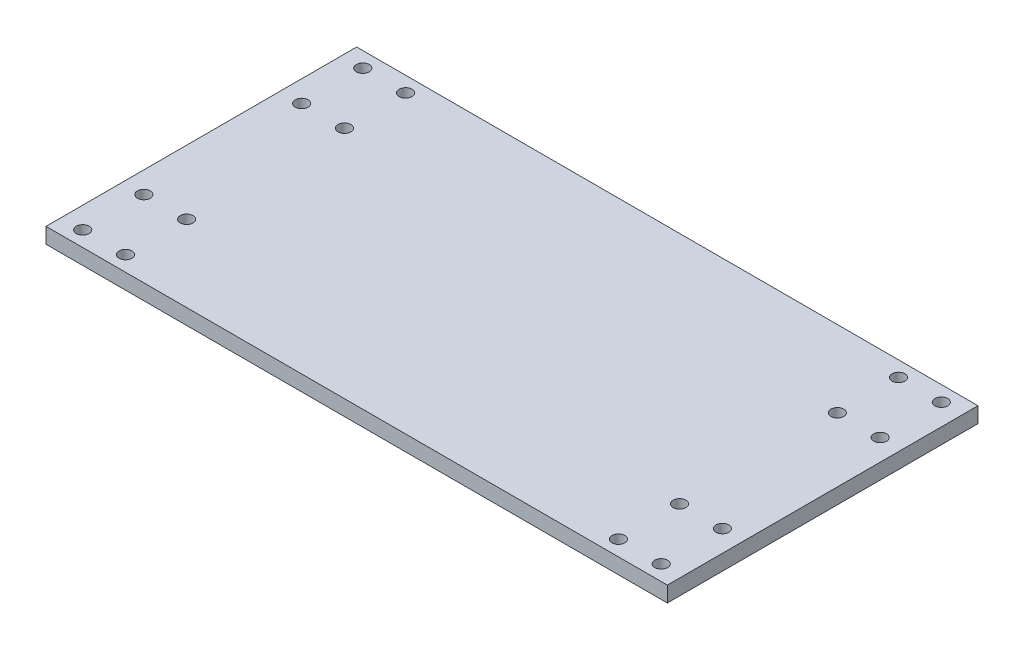
ISO-10303-21;
HEADER;
FILE_DESCRIPTION(('STEP AP214'),'2;1');
FILE_NAME('part.step','',(''),(''),'','','');
FILE_SCHEMA(('AUTOMOTIVE_DESIGN { 1 0 10303 214 1 1 1 1 }'));
ENDSEC;
DATA;
#1=APPLICATION_CONTEXT('core data for automotive mechanical design processes');
#2=APPLICATION_PROTOCOL_DEFINITION('international standard','automotive_design',2000,#1);
#3=PRODUCT_CONTEXT('',#1,'mechanical');
#4=PRODUCT('Part','Part','',(#3));
#5=PRODUCT_RELATED_PRODUCT_CATEGORY('part','',(#4));
#6=PRODUCT_DEFINITION_FORMATION('','',#4);
#7=PRODUCT_DEFINITION_CONTEXT('part definition',#1,'design');
#8=PRODUCT_DEFINITION('design','',#6,#7);
#9=PRODUCT_DEFINITION_SHAPE('','',#8);
#10=(LENGTH_UNIT() NAMED_UNIT(*) SI_UNIT(.MILLI.,.METRE.));
#11=(NAMED_UNIT(*) PLANE_ANGLE_UNIT() SI_UNIT($,.RADIAN.));
#12=(NAMED_UNIT(*) SI_UNIT($,.STERADIAN.) SOLID_ANGLE_UNIT());
#13=UNCERTAINTY_MEASURE_WITH_UNIT(LENGTH_MEASURE(1.E-05),#10,'distance_accuracy_value','');
#14=(GEOMETRIC_REPRESENTATION_CONTEXT(3) GLOBAL_UNCERTAINTY_ASSIGNED_CONTEXT((#13)) GLOBAL_UNIT_ASSIGNED_CONTEXT((#10,
#11,#12)) REPRESENTATION_CONTEXT('',''));
#15=CARTESIAN_POINT('',(0.,0.,0.));
#16=DIRECTION('',(0.,0.,1.));
#17=DIRECTION('',(1.,0.,0.));
#18=AXIS2_PLACEMENT_3D('',#15,#16,#17);
#19=CARTESIAN_POINT('',(0.,5.08,0.));
#20=DIRECTION('',(0.,1.,0.));
#21=DIRECTION('',(0.,0.,1.));
#22=AXIS2_PLACEMENT_3D('',#19,#20,#21);
#23=PLANE('',#22);
#24=CARTESIAN_POINT('',(196.2,5.08,5.00000000000002));
#25=DIRECTION('',(0.,-1.,0.));
#26=DIRECTION('',(0.,0.,-1.));
#27=AXIS2_PLACEMENT_3D('',#24,#25,#26);
#28=CIRCLE('',#27,2.09999999999999);
#29=CARTESIAN_POINT('',(196.2,5.08,2.90000000000003));
#30=VERTEX_POINT('',#29);
#31=EDGE_CURVE('E207',#30,#30,#28,.T.);
#32=ORIENTED_EDGE('',*,*,#31,.T.);
#33=EDGE_LOOP('',(#32));
#34=FACE_BOUND('',#33,.T.);
#35=CARTESIAN_POINT('',(182.2,5.08,5.00000000000002));
#36=DIRECTION('',(0.,-1.,0.));
#37=DIRECTION('',(0.,0.,-1.));
#38=AXIS2_PLACEMENT_3D('',#35,#36,#37);
#39=CIRCLE('',#38,2.09999999999999);
#40=CARTESIAN_POINT('',(182.2,5.08,2.90000000000003));
#41=VERTEX_POINT('',#40);
#42=EDGE_CURVE('E201',#41,#41,#39,.T.);
#43=ORIENTED_EDGE('',*,*,#42,.T.);
#44=EDGE_LOOP('',(#43));
#45=FACE_BOUND('',#44,.T.);
#46=CARTESIAN_POINT('',(196.2,5.08,25.));
#47=DIRECTION('',(0.,-1.,0.));
#48=DIRECTION('',(0.,0.,-1.));
#49=AXIS2_PLACEMENT_3D('',#46,#47,#48);
#50=CIRCLE('',#49,2.09999999999999);
#51=CARTESIAN_POINT('',(196.2,5.08,22.9));
#52=VERTEX_POINT('',#51);
#53=EDGE_CURVE('E195',#52,#52,#50,.T.);
#54=ORIENTED_EDGE('',*,*,#53,.T.);
#55=EDGE_LOOP('',(#54));
#56=FACE_BOUND('',#55,.T.);
#57=CARTESIAN_POINT('',(182.2,5.08,25.));
#58=DIRECTION('',(0.,-1.,0.));
#59=DIRECTION('',(0.,0.,-1.));
#60=AXIS2_PLACEMENT_3D('',#57,#58,#59);
#61=CIRCLE('',#60,2.09999999999999);
#62=CARTESIAN_POINT('',(182.2,5.08,22.9));
#63=VERTEX_POINT('',#62);
#64=EDGE_CURVE('E189',#63,#63,#61,.T.);
#65=ORIENTED_EDGE('',*,*,#64,.T.);
#66=EDGE_LOOP('',(#65));
#67=FACE_BOUND('',#66,.T.);
#68=DIRECTION('',(0.,0.,1.));
#69=VECTOR('',#68,1.);
#70=CARTESIAN_POINT('',(0.,5.08,0.));
#71=LINE('',#70,#69);
#72=CARTESIAN_POINT('',(0.,5.08,0.));
#73=VERTEX_POINT('',#72);
#74=CARTESIAN_POINT('',(0.,5.08,101.6));
#75=VERTEX_POINT('',#74);
#76=EDGE_CURVE('E91',#73,#75,#71,.T.);
#77=ORIENTED_EDGE('',*,*,#76,.T.);
#78=DIRECTION('',(1.,0.,0.));
#79=VECTOR('',#78,1.);
#80=CARTESIAN_POINT('',(0.,5.08,101.6));
#81=LINE('',#80,#79);
#82=CARTESIAN_POINT('',(203.2,5.08,101.6));
#83=VERTEX_POINT('',#82);
#84=EDGE_CURVE('E86',#75,#83,#81,.T.);
#85=ORIENTED_EDGE('',*,*,#84,.T.);
#86=DIRECTION('',(0.,0.,-1.));
#87=VECTOR('',#86,1.);
#88=CARTESIAN_POINT('',(203.2,5.08,0.));
#89=LINE('',#88,#87);
#90=CARTESIAN_POINT('',(203.2,5.08,0.));
#91=VERTEX_POINT('',#90);
#92=EDGE_CURVE('E89',#83,#91,#89,.T.);
#93=ORIENTED_EDGE('',*,*,#92,.T.);
#94=DIRECTION('',(-1.,0.,0.));
#95=VECTOR('',#94,1.);
#96=CARTESIAN_POINT('',(0.,5.08,0.));
#97=LINE('',#96,#95);
#98=EDGE_CURVE('E56',#91,#73,#97,.T.);
#99=ORIENTED_EDGE('',*,*,#98,.T.);
#100=EDGE_LOOP('',(#77,#85,#93,#99));
#101=FACE_BOUND('',#100,.T.);
#102=CARTESIAN_POINT('',(7.00000000000003,5.08,96.6));
#103=DIRECTION('',(0.,-1.,0.));
#104=DIRECTION('',(0.,0.,-1.));
#105=AXIS2_PLACEMENT_3D('',#102,#103,#104);
#106=CIRCLE('',#105,2.1);
#107=CARTESIAN_POINT('',(7.00000000000003,5.08,94.5));
#108=VERTEX_POINT('',#107);
#109=EDGE_CURVE('E106',#108,#108,#106,.T.);
#110=ORIENTED_EDGE('',*,*,#109,.T.);
#111=EDGE_LOOP('',(#110));
#112=FACE_BOUND('',#111,.T.);
#113=CARTESIAN_POINT('',(21.,5.08,96.6));
#114=DIRECTION('',(0.,-1.,0.));
#115=DIRECTION('',(0.,0.,-1.));
#116=AXIS2_PLACEMENT_3D('',#113,#114,#115);
#117=CIRCLE('',#116,2.1);
#118=CARTESIAN_POINT('',(21.,5.08,94.5));
#119=VERTEX_POINT('',#118);
#120=EDGE_CURVE('E123',#119,#119,#117,.T.);
#121=ORIENTED_EDGE('',*,*,#120,.T.);
#122=EDGE_LOOP('',(#121));
#123=FACE_BOUND('',#122,.T.);
#124=CARTESIAN_POINT('',(21.,5.08,76.6));
#125=DIRECTION('',(0.,-1.,0.));
#126=DIRECTION('',(0.,0.,-1.));
#127=AXIS2_PLACEMENT_3D('',#124,#125,#126);
#128=CIRCLE('',#127,2.1);
#129=CARTESIAN_POINT('',(21.,5.08,74.5));
#130=VERTEX_POINT('',#129);
#131=EDGE_CURVE('E129',#130,#130,#128,.T.);
#132=ORIENTED_EDGE('',*,*,#131,.T.);
#133=EDGE_LOOP('',(#132));
#134=FACE_BOUND('',#133,.T.);
#135=CARTESIAN_POINT('',(196.2,5.08,96.5999999999999));
#136=DIRECTION('',(0.,-1.,0.));
#137=DIRECTION('',(0.,0.,-1.));
#138=AXIS2_PLACEMENT_3D('',#135,#136,#137);
#139=CIRCLE('',#138,2.09999999999999);
#140=CARTESIAN_POINT('',(196.2,5.08,94.4999999999999));
#141=VERTEX_POINT('',#140);
#142=EDGE_CURVE('E135',#141,#141,#139,.T.);
#143=ORIENTED_EDGE('',*,*,#142,.T.);
#144=EDGE_LOOP('',(#143));
#145=FACE_BOUND('',#144,.T.);
#146=CARTESIAN_POINT('',(182.2,5.08,96.5999999999999));
#147=DIRECTION('',(0.,-1.,0.));
#148=DIRECTION('',(0.,0.,-1.));
#149=AXIS2_PLACEMENT_3D('',#146,#147,#148);
#150=CIRCLE('',#149,2.09999999999999);
#151=CARTESIAN_POINT('',(182.2,5.08,94.4999999999999));
#152=VERTEX_POINT('',#151);
#153=EDGE_CURVE('E141',#152,#152,#150,.T.);
#154=ORIENTED_EDGE('',*,*,#153,.T.);
#155=EDGE_LOOP('',(#154));
#156=FACE_BOUND('',#155,.T.);
#157=CARTESIAN_POINT('',(182.2,5.08,76.5999999999999));
#158=DIRECTION('',(0.,-1.,0.));
#159=DIRECTION('',(0.,0.,-1.));
#160=AXIS2_PLACEMENT_3D('',#157,#158,#159);
#161=CIRCLE('',#160,2.09999999999999);
#162=CARTESIAN_POINT('',(182.2,5.08,74.4999999999999));
#163=VERTEX_POINT('',#162);
#164=EDGE_CURVE('E147',#163,#163,#161,.T.);
#165=ORIENTED_EDGE('',*,*,#164,.T.);
#166=EDGE_LOOP('',(#165));
#167=FACE_BOUND('',#166,.T.);
#168=CARTESIAN_POINT('',(196.2,5.08,76.5999999999999));
#169=DIRECTION('',(0.,-1.,0.));
#170=DIRECTION('',(0.,0.,-1.));
#171=AXIS2_PLACEMENT_3D('',#168,#169,#170);
#172=CIRCLE('',#171,2.09999999999999);
#173=CARTESIAN_POINT('',(196.2,5.08,74.4999999999999));
#174=VERTEX_POINT('',#173);
#175=EDGE_CURVE('E153',#174,#174,#172,.T.);
#176=ORIENTED_EDGE('',*,*,#175,.T.);
#177=EDGE_LOOP('',(#176));
#178=FACE_BOUND('',#177,.T.);
#179=CARTESIAN_POINT('',(7.00000000000003,5.08,76.6));
#180=DIRECTION('',(0.,-1.,0.));
#181=DIRECTION('',(0.,0.,-1.));
#182=AXIS2_PLACEMENT_3D('',#179,#180,#181);
#183=CIRCLE('',#182,2.1);
#184=CARTESIAN_POINT('',(7.00000000000003,5.08,74.5));
#185=VERTEX_POINT('',#184);
#186=EDGE_CURVE('E159',#185,#185,#183,.T.);
#187=ORIENTED_EDGE('',*,*,#186,.T.);
#188=EDGE_LOOP('',(#187));
#189=FACE_BOUND('',#188,.T.);
#190=CARTESIAN_POINT('',(7.00000000000003,5.08,25.));
#191=DIRECTION('',(0.,-1.,0.));
#192=DIRECTION('',(0.,0.,-1.));
#193=AXIS2_PLACEMENT_3D('',#190,#191,#192);
#194=CIRCLE('',#193,2.1);
#195=CARTESIAN_POINT('',(7.00000000000003,5.08,22.9));
#196=VERTEX_POINT('',#195);
#197=EDGE_CURVE('E165',#196,#196,#194,.T.);
#198=ORIENTED_EDGE('',*,*,#197,.T.);
#199=EDGE_LOOP('',(#198));
#200=FACE_BOUND('',#199,.T.);
#201=CARTESIAN_POINT('',(21.,5.08,25.));
#202=DIRECTION('',(0.,-1.,0.));
#203=DIRECTION('',(0.,0.,-1.));
#204=AXIS2_PLACEMENT_3D('',#201,#202,#203);
#205=CIRCLE('',#204,2.1);
#206=CARTESIAN_POINT('',(21.,5.08,22.9));
#207=VERTEX_POINT('',#206);
#208=EDGE_CURVE('E171',#207,#207,#205,.T.);
#209=ORIENTED_EDGE('',*,*,#208,.T.);
#210=EDGE_LOOP('',(#209));
#211=FACE_BOUND('',#210,.T.);
#212=CARTESIAN_POINT('',(7.00000000000003,5.08,5.00000000000002));
#213=DIRECTION('',(0.,-1.,0.));
#214=DIRECTION('',(0.,0.,-1.));
#215=AXIS2_PLACEMENT_3D('',#212,#213,#214);
#216=CIRCLE('',#215,2.1);
#217=CARTESIAN_POINT('',(7.00000000000003,5.08,2.90000000000002));
#218=VERTEX_POINT('',#217);
#219=EDGE_CURVE('E177',#218,#218,#216,.T.);
#220=ORIENTED_EDGE('',*,*,#219,.T.);
#221=EDGE_LOOP('',(#220));
#222=FACE_BOUND('',#221,.T.);
#223=CARTESIAN_POINT('',(21.,5.08,5.00000000000002));
#224=DIRECTION('',(0.,-1.,0.));
#225=DIRECTION('',(0.,0.,-1.));
#226=AXIS2_PLACEMENT_3D('',#223,#224,#225);
#227=CIRCLE('',#226,2.1);
#228=CARTESIAN_POINT('',(21.,5.08,2.90000000000002));
#229=VERTEX_POINT('',#228);
#230=EDGE_CURVE('E183',#229,#229,#227,.T.);
#231=ORIENTED_EDGE('',*,*,#230,.T.);
#232=EDGE_LOOP('',(#231));
#233=FACE_BOUND('',#232,.T.);
#234=ADVANCED_FACE('F39',(#34,#45,#56,#67,#101,#112,#123,#134,#145,#156,#167,#178,#189,#200,
#211,#222,#233),#23,.T.);
#235=CARTESIAN_POINT('',(0.,0.,0.));
#236=DIRECTION('',(0.,1.,0.));
#237=DIRECTION('',(0.,0.,1.));
#238=AXIS2_PLACEMENT_3D('',#235,#236,#237);
#239=PLANE('',#238);
#240=CARTESIAN_POINT('',(196.2,0.,5.00000000000002));
#241=DIRECTION('',(0.,-1.,0.));
#242=DIRECTION('',(0.,0.,-1.));
#243=AXIS2_PLACEMENT_3D('',#240,#241,#242);
#244=CIRCLE('',#243,2.09999999999999);
#245=CARTESIAN_POINT('',(196.2,0.,2.90000000000003));
#246=VERTEX_POINT('',#245);
#247=EDGE_CURVE('E210',#246,#246,#244,.T.);
#248=ORIENTED_EDGE('',*,*,#247,.F.);
#249=EDGE_LOOP('',(#248));
#250=FACE_BOUND('',#249,.T.);
#251=CARTESIAN_POINT('',(182.2,0.,5.00000000000002));
#252=DIRECTION('',(0.,-1.,0.));
#253=DIRECTION('',(0.,0.,-1.));
#254=AXIS2_PLACEMENT_3D('',#251,#252,#253);
#255=CIRCLE('',#254,2.09999999999999);
#256=CARTESIAN_POINT('',(182.2,0.,2.90000000000003));
#257=VERTEX_POINT('',#256);
#258=EDGE_CURVE('E204',#257,#257,#255,.T.);
#259=ORIENTED_EDGE('',*,*,#258,.F.);
#260=EDGE_LOOP('',(#259));
#261=FACE_BOUND('',#260,.T.);
#262=CARTESIAN_POINT('',(196.2,0.,25.));
#263=DIRECTION('',(0.,-1.,0.));
#264=DIRECTION('',(0.,0.,-1.));
#265=AXIS2_PLACEMENT_3D('',#262,#263,#264);
#266=CIRCLE('',#265,2.09999999999999);
#267=CARTESIAN_POINT('',(196.2,0.,22.9));
#268=VERTEX_POINT('',#267);
#269=EDGE_CURVE('E198',#268,#268,#266,.T.);
#270=ORIENTED_EDGE('',*,*,#269,.F.);
#271=EDGE_LOOP('',(#270));
#272=FACE_BOUND('',#271,.T.);
#273=CARTESIAN_POINT('',(182.2,0.,25.));
#274=DIRECTION('',(0.,-1.,0.));
#275=DIRECTION('',(0.,0.,-1.));
#276=AXIS2_PLACEMENT_3D('',#273,#274,#275);
#277=CIRCLE('',#276,2.09999999999999);
#278=CARTESIAN_POINT('',(182.2,0.,22.9));
#279=VERTEX_POINT('',#278);
#280=EDGE_CURVE('E192',#279,#279,#277,.T.);
#281=ORIENTED_EDGE('',*,*,#280,.F.);
#282=EDGE_LOOP('',(#281));
#283=FACE_BOUND('',#282,.T.);
#284=CARTESIAN_POINT('',(21.,0.,5.00000000000002));
#285=DIRECTION('',(0.,-1.,0.));
#286=DIRECTION('',(0.,0.,-1.));
#287=AXIS2_PLACEMENT_3D('',#284,#285,#286);
#288=CIRCLE('',#287,2.09999999999999);
#289=CARTESIAN_POINT('',(21.,0.,2.90000000000003));
#290=VERTEX_POINT('',#289);
#291=EDGE_CURVE('E186',#290,#290,#288,.T.);
#292=ORIENTED_EDGE('',*,*,#291,.F.);
#293=EDGE_LOOP('',(#292));
#294=FACE_BOUND('',#293,.T.);
#295=CARTESIAN_POINT('',(7.00000000000003,0.,5.00000000000002));
#296=DIRECTION('',(0.,-1.,0.));
#297=DIRECTION('',(0.,0.,-1.));
#298=AXIS2_PLACEMENT_3D('',#295,#296,#297);
#299=CIRCLE('',#298,2.09999999999999);
#300=CARTESIAN_POINT('',(7.00000000000003,0.,2.90000000000003));
#301=VERTEX_POINT('',#300);
#302=EDGE_CURVE('E180',#301,#301,#299,.T.);
#303=ORIENTED_EDGE('',*,*,#302,.F.);
#304=EDGE_LOOP('',(#303));
#305=FACE_BOUND('',#304,.T.);
#306=CARTESIAN_POINT('',(21.,0.,25.));
#307=DIRECTION('',(0.,-1.,0.));
#308=DIRECTION('',(0.,0.,-1.));
#309=AXIS2_PLACEMENT_3D('',#306,#307,#308);
#310=CIRCLE('',#309,2.09999999999999);
#311=CARTESIAN_POINT('',(21.,0.,22.9));
#312=VERTEX_POINT('',#311);
#313=EDGE_CURVE('E174',#312,#312,#310,.T.);
#314=ORIENTED_EDGE('',*,*,#313,.F.);
#315=EDGE_LOOP('',(#314));
#316=FACE_BOUND('',#315,.T.);
#317=CARTESIAN_POINT('',(7.00000000000003,0.,25.));
#318=DIRECTION('',(0.,-1.,0.));
#319=DIRECTION('',(0.,0.,-1.));
#320=AXIS2_PLACEMENT_3D('',#317,#318,#319);
#321=CIRCLE('',#320,2.09999999999999);
#322=CARTESIAN_POINT('',(7.00000000000003,0.,22.9));
#323=VERTEX_POINT('',#322);
#324=EDGE_CURVE('E168',#323,#323,#321,.T.);
#325=ORIENTED_EDGE('',*,*,#324,.F.);
#326=EDGE_LOOP('',(#325));
#327=FACE_BOUND('',#326,.T.);
#328=CARTESIAN_POINT('',(7.00000000000003,0.,76.6));
#329=DIRECTION('',(0.,-1.,0.));
#330=DIRECTION('',(0.,0.,-1.));
#331=AXIS2_PLACEMENT_3D('',#328,#329,#330);
#332=CIRCLE('',#331,2.09999999999999);
#333=CARTESIAN_POINT('',(7.00000000000003,0.,74.5));
#334=VERTEX_POINT('',#333);
#335=EDGE_CURVE('E162',#334,#334,#332,.T.);
#336=ORIENTED_EDGE('',*,*,#335,.F.);
#337=EDGE_LOOP('',(#336));
#338=FACE_BOUND('',#337,.T.);
#339=CARTESIAN_POINT('',(182.2,0.,76.5999999999999));
#340=DIRECTION('',(0.,-1.,0.));
#341=DIRECTION('',(0.,0.,-1.));
#342=AXIS2_PLACEMENT_3D('',#339,#340,#341);
#343=CIRCLE('',#342,2.09999999999999);
#344=CARTESIAN_POINT('',(182.2,0.,74.4999999999999));
#345=VERTEX_POINT('',#344);
#346=EDGE_CURVE('E150',#345,#345,#343,.T.);
#347=ORIENTED_EDGE('',*,*,#346,.F.);
#348=EDGE_LOOP('',(#347));
#349=FACE_BOUND('',#348,.T.);
#350=CARTESIAN_POINT('',(182.2,0.,96.5999999999999));
#351=DIRECTION('',(0.,-1.,0.));
#352=DIRECTION('',(0.,0.,-1.));
#353=AXIS2_PLACEMENT_3D('',#350,#351,#352);
#354=CIRCLE('',#353,2.09999999999999);
#355=CARTESIAN_POINT('',(182.2,0.,94.4999999999999));
#356=VERTEX_POINT('',#355);
#357=EDGE_CURVE('E144',#356,#356,#354,.T.);
#358=ORIENTED_EDGE('',*,*,#357,.F.);
#359=EDGE_LOOP('',(#358));
#360=FACE_BOUND('',#359,.T.);
#361=CARTESIAN_POINT('',(196.2,0.,96.5999999999999));
#362=DIRECTION('',(0.,-1.,0.));
#363=DIRECTION('',(0.,0.,-1.));
#364=AXIS2_PLACEMENT_3D('',#361,#362,#363);
#365=CIRCLE('',#364,2.09999999999999);
#366=CARTESIAN_POINT('',(196.2,0.,94.4999999999999));
#367=VERTEX_POINT('',#366);
#368=EDGE_CURVE('E138',#367,#367,#365,.T.);
#369=ORIENTED_EDGE('',*,*,#368,.F.);
#370=EDGE_LOOP('',(#369));
#371=FACE_BOUND('',#370,.T.);
#372=CARTESIAN_POINT('',(21.,0.,76.6));
#373=DIRECTION('',(0.,-1.,0.));
#374=DIRECTION('',(0.,0.,-1.));
#375=AXIS2_PLACEMENT_3D('',#372,#373,#374);
#376=CIRCLE('',#375,2.09999999999999);
#377=CARTESIAN_POINT('',(21.,0.,74.5));
#378=VERTEX_POINT('',#377);
#379=EDGE_CURVE('E132',#378,#378,#376,.T.);
#380=ORIENTED_EDGE('',*,*,#379,.F.);
#381=EDGE_LOOP('',(#380));
#382=FACE_BOUND('',#381,.T.);
#383=CARTESIAN_POINT('',(21.,0.,96.6));
#384=DIRECTION('',(0.,-1.,0.));
#385=DIRECTION('',(0.,0.,-1.));
#386=AXIS2_PLACEMENT_3D('',#383,#384,#385);
#387=CIRCLE('',#386,2.09999999999999);
#388=CARTESIAN_POINT('',(21.,0.,94.5));
#389=VERTEX_POINT('',#388);
#390=EDGE_CURVE('E126',#389,#389,#387,.T.);
#391=ORIENTED_EDGE('',*,*,#390,.F.);
#392=EDGE_LOOP('',(#391));
#393=FACE_BOUND('',#392,.T.);
#394=CARTESIAN_POINT('',(7.00000000000003,0.,96.6));
#395=DIRECTION('',(0.,-1.,0.));
#396=DIRECTION('',(0.,0.,-1.));
#397=AXIS2_PLACEMENT_3D('',#394,#395,#396);
#398=CIRCLE('',#397,2.09999999999999);
#399=CARTESIAN_POINT('',(7.00000000000003,0.,94.5));
#400=VERTEX_POINT('',#399);
#401=EDGE_CURVE('E120',#400,#400,#398,.T.);
#402=ORIENTED_EDGE('',*,*,#401,.F.);
#403=EDGE_LOOP('',(#402));
#404=FACE_BOUND('',#403,.T.);
#405=DIRECTION('',(0.,0.,1.));
#406=VECTOR('',#405,1.);
#407=CARTESIAN_POINT('',(0.,0.,0.));
#408=LINE('',#407,#406);
#409=CARTESIAN_POINT('',(0.,0.,0.));
#410=VERTEX_POINT('',#409);
#411=CARTESIAN_POINT('',(0.,0.,101.6));
#412=VERTEX_POINT('',#411);
#413=EDGE_CURVE('E103',#410,#412,#408,.T.);
#414=ORIENTED_EDGE('',*,*,#413,.F.);
#415=DIRECTION('',(-1.,0.,0.));
#416=VECTOR('',#415,1.);
#417=CARTESIAN_POINT('',(0.,0.,0.));
#418=LINE('',#417,#416);
#419=CARTESIAN_POINT('',(203.2,0.,0.));
#420=VERTEX_POINT('',#419);
#421=EDGE_CURVE('E79',#420,#410,#418,.T.);
#422=ORIENTED_EDGE('',*,*,#421,.F.);
#423=DIRECTION('',(0.,0.,-1.));
#424=VECTOR('',#423,1.);
#425=CARTESIAN_POINT('',(203.2,0.,0.));
#426=LINE('',#425,#424);
#427=CARTESIAN_POINT('',(203.2,0.,101.6));
#428=VERTEX_POINT('',#427);
#429=EDGE_CURVE('E73',#428,#420,#426,.T.);
#430=ORIENTED_EDGE('',*,*,#429,.F.);
#431=DIRECTION('',(1.,0.,0.));
#432=VECTOR('',#431,1.);
#433=CARTESIAN_POINT('',(0.,0.,101.6));
#434=LINE('',#433,#432);
#435=EDGE_CURVE('E95',#412,#428,#434,.T.);
#436=ORIENTED_EDGE('',*,*,#435,.F.);
#437=EDGE_LOOP('',(#414,#422,#430,#436));
#438=FACE_BOUND('',#437,.T.);
#439=CARTESIAN_POINT('',(196.2,0.,76.5999999999999));
#440=DIRECTION('',(0.,-1.,0.));
#441=DIRECTION('',(0.,0.,-1.));
#442=AXIS2_PLACEMENT_3D('',#439,#440,#441);
#443=CIRCLE('',#442,2.09999999999999);
#444=CARTESIAN_POINT('',(196.2,0.,74.4999999999999));
#445=VERTEX_POINT('',#444);
#446=EDGE_CURVE('E156',#445,#445,#443,.T.);
#447=ORIENTED_EDGE('',*,*,#446,.F.);
#448=EDGE_LOOP('',(#447));
#449=FACE_BOUND('',#448,.T.);
#450=ADVANCED_FACE('F114',(#250,#261,#272,#283,#294,#305,#316,#327,#338,#349,#360,#371,#382,
#393,#404,#438,#449),#239,.F.);
#451=CARTESIAN_POINT('',(0.,5.08,0.));
#452=DIRECTION('',(1.,0.,0.));
#453=DIRECTION('',(0.,0.,-1.));
#454=AXIS2_PLACEMENT_3D('',#451,#452,#453);
#455=PLANE('',#454);
#456=ORIENTED_EDGE('',*,*,#413,.T.);
#457=DIRECTION('',(0.,-1.,0.));
#458=VECTOR('',#457,1.);
#459=CARTESIAN_POINT('',(0.,5.08,101.6));
#460=LINE('',#459,#458);
#461=EDGE_CURVE('E11',#75,#412,#460,.T.);
#462=ORIENTED_EDGE('',*,*,#461,.F.);
#463=ORIENTED_EDGE('',*,*,#76,.F.);
#464=DIRECTION('',(0.,-1.,0.));
#465=VECTOR('',#464,1.);
#466=CARTESIAN_POINT('',(0.,5.08,0.));
#467=LINE('',#466,#465);
#468=EDGE_CURVE('E99',#73,#410,#467,.T.);
#469=ORIENTED_EDGE('',*,*,#468,.T.);
#470=EDGE_LOOP('',(#456,#462,#463,#469));
#471=FACE_BOUND('',#470,.T.);
#472=ADVANCED_FACE('F41',(#471),#455,.F.);
#473=CARTESIAN_POINT('',(0.,5.08,101.6));
#474=DIRECTION('',(0.,0.,-1.));
#475=DIRECTION('',(-1.,0.,0.));
#476=AXIS2_PLACEMENT_3D('',#473,#474,#475);
#477=PLANE('',#476);
#478=ORIENTED_EDGE('',*,*,#435,.T.);
#479=DIRECTION('',(0.,-1.,0.));
#480=VECTOR('',#479,1.);
#481=CARTESIAN_POINT('',(203.2,5.08,101.6));
#482=LINE('',#481,#480);
#483=EDGE_CURVE('E48',#83,#428,#482,.T.);
#484=ORIENTED_EDGE('',*,*,#483,.F.);
#485=ORIENTED_EDGE('',*,*,#84,.F.);
#486=ORIENTED_EDGE('',*,*,#461,.T.);
#487=EDGE_LOOP('',(#478,#484,#485,#486));
#488=FACE_BOUND('',#487,.T.);
#489=ADVANCED_FACE('F94',(#488),#477,.F.);
#490=CARTESIAN_POINT('',(203.2,5.08,0.));
#491=DIRECTION('',(-1.,0.,0.));
#492=DIRECTION('',(0.,0.,1.));
#493=AXIS2_PLACEMENT_3D('',#490,#491,#492);
#494=PLANE('',#493);
#495=ORIENTED_EDGE('',*,*,#429,.T.);
#496=DIRECTION('',(0.,-1.,0.));
#497=VECTOR('',#496,1.);
#498=CARTESIAN_POINT('',(203.2,5.08,0.));
#499=LINE('',#498,#497);
#500=EDGE_CURVE('E96',#91,#420,#499,.T.);
#501=ORIENTED_EDGE('',*,*,#500,.F.);
#502=ORIENTED_EDGE('',*,*,#92,.F.);
#503=ORIENTED_EDGE('',*,*,#483,.T.);
#504=EDGE_LOOP('',(#495,#501,#502,#503));
#505=FACE_BOUND('',#504,.T.);
#506=ADVANCED_FACE('F97',(#505),#494,.F.);
#507=CARTESIAN_POINT('',(0.,5.08,0.));
#508=DIRECTION('',(0.,0.,1.));
#509=DIRECTION('',(1.,0.,0.));
#510=AXIS2_PLACEMENT_3D('',#507,#508,#509);
#511=PLANE('',#510);
#512=ORIENTED_EDGE('',*,*,#421,.T.);
#513=ORIENTED_EDGE('',*,*,#468,.F.);
#514=ORIENTED_EDGE('',*,*,#98,.F.);
#515=ORIENTED_EDGE('',*,*,#500,.T.);
#516=EDGE_LOOP('',(#512,#513,#514,#515));
#517=FACE_BOUND('',#516,.T.);
#518=ADVANCED_FACE('F111',(#517),#511,.F.);
#519=CARTESIAN_POINT('',(7.00000000000003,0.,96.6));
#520=DIRECTION('',(0.,-1.,0.));
#521=DIRECTION('',(0.,0.,-1.));
#522=AXIS2_PLACEMENT_3D('',#519,#520,#521);
#523=CYLINDRICAL_SURFACE('',#522,2.09999999999999);
#524=ORIENTED_EDGE('',*,*,#109,.F.);
#525=EDGE_LOOP('',(#524));
#526=FACE_BOUND('',#525,.T.);
#527=ORIENTED_EDGE('',*,*,#401,.T.);
#528=EDGE_LOOP('',(#527));
#529=FACE_BOUND('',#528,.T.);
#530=ADVANCED_FACE('F247',(#526,#529),#523,.F.);
#531=CARTESIAN_POINT('',(21.,0.,96.6));
#532=DIRECTION('',(0.,-1.,0.));
#533=DIRECTION('',(0.,0.,-1.));
#534=AXIS2_PLACEMENT_3D('',#531,#532,#533);
#535=CYLINDRICAL_SURFACE('',#534,2.09999999999999);
#536=ORIENTED_EDGE('',*,*,#120,.F.);
#537=EDGE_LOOP('',(#536));
#538=FACE_BOUND('',#537,.T.);
#539=ORIENTED_EDGE('',*,*,#390,.T.);
#540=EDGE_LOOP('',(#539));
#541=FACE_BOUND('',#540,.T.);
#542=ADVANCED_FACE('F249',(#538,#541),#535,.F.);
#543=CARTESIAN_POINT('',(21.,0.,76.6));
#544=DIRECTION('',(0.,-1.,0.));
#545=DIRECTION('',(0.,0.,-1.));
#546=AXIS2_PLACEMENT_3D('',#543,#544,#545);
#547=CYLINDRICAL_SURFACE('',#546,2.09999999999999);
#548=ORIENTED_EDGE('',*,*,#131,.F.);
#549=EDGE_LOOP('',(#548));
#550=FACE_BOUND('',#549,.T.);
#551=ORIENTED_EDGE('',*,*,#379,.T.);
#552=EDGE_LOOP('',(#551));
#553=FACE_BOUND('',#552,.T.);
#554=ADVANCED_FACE('F255',(#550,#553),#547,.F.);
#555=CARTESIAN_POINT('',(196.2,0.,96.5999999999999));
#556=DIRECTION('',(0.,-1.,0.));
#557=DIRECTION('',(0.,0.,-1.));
#558=AXIS2_PLACEMENT_3D('',#555,#556,#557);
#559=CYLINDRICAL_SURFACE('',#558,2.09999999999999);
#560=ORIENTED_EDGE('',*,*,#142,.F.);
#561=EDGE_LOOP('',(#560));
#562=FACE_BOUND('',#561,.T.);
#563=ORIENTED_EDGE('',*,*,#368,.T.);
#564=EDGE_LOOP('',(#563));
#565=FACE_BOUND('',#564,.T.);
#566=ADVANCED_FACE('F320',(#562,#565),#559,.F.);
#567=CARTESIAN_POINT('',(182.2,0.,96.5999999999999));
#568=DIRECTION('',(0.,-1.,0.));
#569=DIRECTION('',(0.,0.,-1.));
#570=AXIS2_PLACEMENT_3D('',#567,#568,#569);
#571=CYLINDRICAL_SURFACE('',#570,2.09999999999999);
#572=ORIENTED_EDGE('',*,*,#153,.F.);
#573=EDGE_LOOP('',(#572));
#574=FACE_BOUND('',#573,.T.);
#575=ORIENTED_EDGE('',*,*,#357,.T.);
#576=EDGE_LOOP('',(#575));
#577=FACE_BOUND('',#576,.T.);
#578=ADVANCED_FACE('F330',(#574,#577),#571,.F.);
#579=CARTESIAN_POINT('',(182.2,0.,76.5999999999999));
#580=DIRECTION('',(0.,-1.,0.));
#581=DIRECTION('',(0.,0.,-1.));
#582=AXIS2_PLACEMENT_3D('',#579,#580,#581);
#583=CYLINDRICAL_SURFACE('',#582,2.09999999999999);
#584=ORIENTED_EDGE('',*,*,#164,.F.);
#585=EDGE_LOOP('',(#584));
#586=FACE_BOUND('',#585,.T.);
#587=ORIENTED_EDGE('',*,*,#346,.T.);
#588=EDGE_LOOP('',(#587));
#589=FACE_BOUND('',#588,.T.);
#590=ADVANCED_FACE('F340',(#586,#589),#583,.F.);
#591=CARTESIAN_POINT('',(196.2,0.,76.5999999999999));
#592=DIRECTION('',(0.,-1.,0.));
#593=DIRECTION('',(0.,0.,-1.));
#594=AXIS2_PLACEMENT_3D('',#591,#592,#593);
#595=CYLINDRICAL_SURFACE('',#594,2.09999999999999);
#596=ORIENTED_EDGE('',*,*,#175,.F.);
#597=EDGE_LOOP('',(#596));
#598=FACE_BOUND('',#597,.T.);
#599=ORIENTED_EDGE('',*,*,#446,.T.);
#600=EDGE_LOOP('',(#599));
#601=FACE_BOUND('',#600,.T.);
#602=ADVANCED_FACE('F350',(#598,#601),#595,.F.);
#603=CARTESIAN_POINT('',(7.00000000000003,0.,76.6));
#604=DIRECTION('',(0.,-1.,0.));
#605=DIRECTION('',(0.,0.,-1.));
#606=AXIS2_PLACEMENT_3D('',#603,#604,#605);
#607=CYLINDRICAL_SURFACE('',#606,2.09999999999999);
#608=ORIENTED_EDGE('',*,*,#186,.F.);
#609=EDGE_LOOP('',(#608));
#610=FACE_BOUND('',#609,.T.);
#611=ORIENTED_EDGE('',*,*,#335,.T.);
#612=EDGE_LOOP('',(#611));
#613=FACE_BOUND('',#612,.T.);
#614=ADVANCED_FACE('F360',(#610,#613),#607,.F.);
#615=CARTESIAN_POINT('',(7.00000000000003,0.,25.));
#616=DIRECTION('',(0.,-1.,0.));
#617=DIRECTION('',(0.,0.,-1.));
#618=AXIS2_PLACEMENT_3D('',#615,#616,#617);
#619=CYLINDRICAL_SURFACE('',#618,2.09999999999999);
#620=ORIENTED_EDGE('',*,*,#197,.F.);
#621=EDGE_LOOP('',(#620));
#622=FACE_BOUND('',#621,.T.);
#623=ORIENTED_EDGE('',*,*,#324,.T.);
#624=EDGE_LOOP('',(#623));
#625=FACE_BOUND('',#624,.T.);
#626=ADVANCED_FACE('F370',(#622,#625),#619,.F.);
#627=CARTESIAN_POINT('',(21.,0.,25.));
#628=DIRECTION('',(0.,-1.,0.));
#629=DIRECTION('',(0.,0.,-1.));
#630=AXIS2_PLACEMENT_3D('',#627,#628,#629);
#631=CYLINDRICAL_SURFACE('',#630,2.09999999999999);
#632=ORIENTED_EDGE('',*,*,#208,.F.);
#633=EDGE_LOOP('',(#632));
#634=FACE_BOUND('',#633,.T.);
#635=ORIENTED_EDGE('',*,*,#313,.T.);
#636=EDGE_LOOP('',(#635));
#637=FACE_BOUND('',#636,.T.);
#638=ADVANCED_FACE('F380',(#634,#637),#631,.F.);
#639=CARTESIAN_POINT('',(7.00000000000003,0.,5.00000000000002));
#640=DIRECTION('',(0.,-1.,0.));
#641=DIRECTION('',(0.,0.,-1.));
#642=AXIS2_PLACEMENT_3D('',#639,#640,#641);
#643=CYLINDRICAL_SURFACE('',#642,2.09999999999999);
#644=ORIENTED_EDGE('',*,*,#219,.F.);
#645=EDGE_LOOP('',(#644));
#646=FACE_BOUND('',#645,.T.);
#647=ORIENTED_EDGE('',*,*,#302,.T.);
#648=EDGE_LOOP('',(#647));
#649=FACE_BOUND('',#648,.T.);
#650=ADVANCED_FACE('F390',(#646,#649),#643,.F.);
#651=CARTESIAN_POINT('',(21.,0.,5.00000000000002));
#652=DIRECTION('',(0.,-1.,0.));
#653=DIRECTION('',(0.,0.,-1.));
#654=AXIS2_PLACEMENT_3D('',#651,#652,#653);
#655=CYLINDRICAL_SURFACE('',#654,2.09999999999999);
#656=ORIENTED_EDGE('',*,*,#230,.F.);
#657=EDGE_LOOP('',(#656));
#658=FACE_BOUND('',#657,.T.);
#659=ORIENTED_EDGE('',*,*,#291,.T.);
#660=EDGE_LOOP('',(#659));
#661=FACE_BOUND('',#660,.T.);
#662=ADVANCED_FACE('F400',(#658,#661),#655,.F.);
#663=CARTESIAN_POINT('',(182.2,0.,25.));
#664=DIRECTION('',(0.,-1.,0.));
#665=DIRECTION('',(0.,0.,-1.));
#666=AXIS2_PLACEMENT_3D('',#663,#664,#665);
#667=CYLINDRICAL_SURFACE('',#666,2.09999999999999);
#668=ORIENTED_EDGE('',*,*,#64,.F.);
#669=EDGE_LOOP('',(#668));
#670=FACE_BOUND('',#669,.T.);
#671=ORIENTED_EDGE('',*,*,#280,.T.);
#672=EDGE_LOOP('',(#671));
#673=FACE_BOUND('',#672,.T.);
#674=ADVANCED_FACE('F410',(#670,#673),#667,.F.);
#675=CARTESIAN_POINT('',(196.2,0.,25.));
#676=DIRECTION('',(0.,-1.,0.));
#677=DIRECTION('',(0.,0.,-1.));
#678=AXIS2_PLACEMENT_3D('',#675,#676,#677);
#679=CYLINDRICAL_SURFACE('',#678,2.09999999999999);
#680=ORIENTED_EDGE('',*,*,#53,.F.);
#681=EDGE_LOOP('',(#680));
#682=FACE_BOUND('',#681,.T.);
#683=ORIENTED_EDGE('',*,*,#269,.T.);
#684=EDGE_LOOP('',(#683));
#685=FACE_BOUND('',#684,.T.);
#686=ADVANCED_FACE('F420',(#682,#685),#679,.F.);
#687=CARTESIAN_POINT('',(182.2,0.,5.00000000000002));
#688=DIRECTION('',(0.,-1.,0.));
#689=DIRECTION('',(0.,0.,-1.));
#690=AXIS2_PLACEMENT_3D('',#687,#688,#689);
#691=CYLINDRICAL_SURFACE('',#690,2.09999999999999);
#692=ORIENTED_EDGE('',*,*,#42,.F.);
#693=EDGE_LOOP('',(#692));
#694=FACE_BOUND('',#693,.T.);
#695=ORIENTED_EDGE('',*,*,#258,.T.);
#696=EDGE_LOOP('',(#695));
#697=FACE_BOUND('',#696,.T.);
#698=ADVANCED_FACE('F430',(#694,#697),#691,.F.);
#699=CARTESIAN_POINT('',(196.2,0.,5.00000000000002));
#700=DIRECTION('',(0.,-1.,0.));
#701=DIRECTION('',(0.,0.,-1.));
#702=AXIS2_PLACEMENT_3D('',#699,#700,#701);
#703=CYLINDRICAL_SURFACE('',#702,2.09999999999999);
#704=ORIENTED_EDGE('',*,*,#31,.F.);
#705=EDGE_LOOP('',(#704));
#706=FACE_BOUND('',#705,.T.);
#707=ORIENTED_EDGE('',*,*,#247,.T.);
#708=EDGE_LOOP('',(#707));
#709=FACE_BOUND('',#708,.T.);
#710=ADVANCED_FACE('F214',(#706,#709),#703,.F.);
#711=CLOSED_SHELL('',(#234,#450,#472,#489,#506,#518,#530,#542,#554,#566,#578,#590,#602,#614,
#626,#638,#650,#662,#674,#686,#698,#710));
#712=MANIFOLD_SOLID_BREP('B2',#711);
#713=ADVANCED_BREP_SHAPE_REPRESENTATION('',(#18,#712),#14);
#714=SHAPE_DEFINITION_REPRESENTATION(#9,#713);
ENDSEC;
END-ISO-10303-21;
